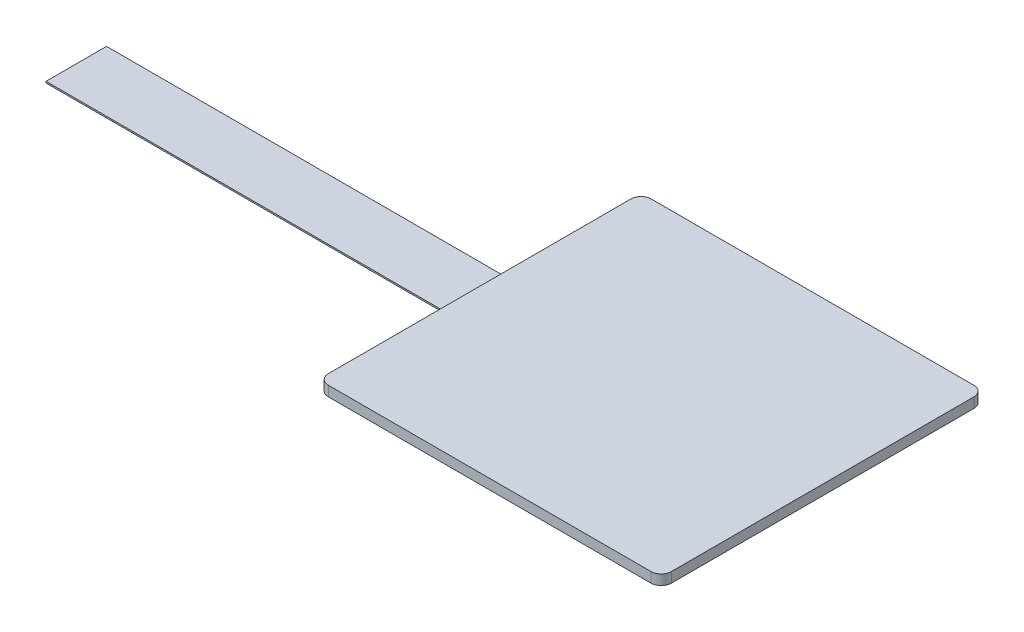
ISO-10303-21;
HEADER;
FILE_DESCRIPTION(('STEP AP214'),'2;1');
FILE_NAME('part.step','',(''),(''),'','','');
FILE_SCHEMA(('AUTOMOTIVE_DESIGN { 1 0 10303 214 1 1 1 1 }'));
ENDSEC;
DATA;
#1=APPLICATION_CONTEXT('core data for automotive mechanical design processes');
#2=APPLICATION_PROTOCOL_DEFINITION('international standard','automotive_design',2000,#1);
#3=PRODUCT_CONTEXT('',#1,'mechanical');
#4=PRODUCT('Part','Part','',(#3));
#5=PRODUCT_RELATED_PRODUCT_CATEGORY('part','',(#4));
#6=PRODUCT_DEFINITION_FORMATION('','',#4);
#7=PRODUCT_DEFINITION_CONTEXT('part definition',#1,'design');
#8=PRODUCT_DEFINITION('design','',#6,#7);
#9=PRODUCT_DEFINITION_SHAPE('','',#8);
#10=(LENGTH_UNIT() NAMED_UNIT(*) SI_UNIT(.MILLI.,.METRE.));
#11=(NAMED_UNIT(*) PLANE_ANGLE_UNIT() SI_UNIT($,.RADIAN.));
#12=(NAMED_UNIT(*) SI_UNIT($,.STERADIAN.) SOLID_ANGLE_UNIT());
#13=UNCERTAINTY_MEASURE_WITH_UNIT(LENGTH_MEASURE(1.E-05),#10,'distance_accuracy_value','');
#14=(GEOMETRIC_REPRESENTATION_CONTEXT(3) GLOBAL_UNCERTAINTY_ASSIGNED_CONTEXT((#13)) GLOBAL_UNIT_ASSIGNED_CONTEXT((#10,
#11,#12)) REPRESENTATION_CONTEXT('',''));
#15=CARTESIAN_POINT('',(0.,0.,0.));
#16=DIRECTION('',(0.,0.,1.));
#17=DIRECTION('',(1.,0.,0.));
#18=AXIS2_PLACEMENT_3D('',#15,#16,#17);
#19=CARTESIAN_POINT('',(-17.,1.,0.));
#20=DIRECTION('',(-1.,0.,0.));
#21=DIRECTION('',(0.,0.,1.));
#22=AXIS2_PLACEMENT_3D('',#19,#20,#21);
#23=PLANE('',#22);
#24=DIRECTION('',(0.,0.,-1.));
#25=VECTOR('',#24,1.);
#26=CARTESIAN_POINT('',(-17.,0.,0.));
#27=LINE('',#26,#25);
#28=CARTESIAN_POINT('',(-17.,0.,15.));
#29=VERTEX_POINT('',#28);
#30=CARTESIAN_POINT('',(-17.,0.,3.));
#31=VERTEX_POINT('',#30);
#32=EDGE_CURVE('E190',#29,#31,#27,.T.);
#33=ORIENTED_EDGE('',*,*,#32,.F.);
#34=DIRECTION('',(0.,-1.,0.));
#35=VECTOR('',#34,1.);
#36=CARTESIAN_POINT('',(-17.,1.,15.));
#37=LINE('',#36,#35);
#38=CARTESIAN_POINT('',(-17.,1.,15.));
#39=VERTEX_POINT('',#38);
#40=EDGE_CURVE('E216',#29,#39,#37,.F.);
#41=ORIENTED_EDGE('',*,*,#40,.T.);
#42=DIRECTION('',(0.,0.,-1.));
#43=VECTOR('',#42,1.);
#44=CARTESIAN_POINT('',(-17.,1.,0.));
#45=LINE('',#44,#43);
#46=CARTESIAN_POINT('',(-17.,1.,-15.));
#47=VERTEX_POINT('',#46);
#48=EDGE_CURVE('E179',#39,#47,#45,.T.);
#49=ORIENTED_EDGE('',*,*,#48,.T.);
#50=DIRECTION('',(0.,-1.,0.));
#51=VECTOR('',#50,1.);
#52=CARTESIAN_POINT('',(-17.,0.,-15.));
#53=LINE('',#52,#51);
#54=CARTESIAN_POINT('',(-17.,0.,-15.));
#55=VERTEX_POINT('',#54);
#56=EDGE_CURVE('E213',#47,#55,#53,.T.);
#57=ORIENTED_EDGE('',*,*,#56,.T.);
#58=CARTESIAN_POINT('',(-17.,0.,-3.));
#59=VERTEX_POINT('',#58);
#60=EDGE_CURVE('E173',#59,#55,#27,.T.);
#61=ORIENTED_EDGE('',*,*,#60,.F.);
#62=DIRECTION('',(0.,1.,0.));
#63=VECTOR('',#62,1.);
#64=CARTESIAN_POINT('',(-17.,-0.05,-3.));
#65=LINE('',#64,#63);
#66=CARTESIAN_POINT('',(-17.,0.1,-3.));
#67=VERTEX_POINT('',#66);
#68=EDGE_CURVE('E177',#59,#67,#65,.T.);
#69=ORIENTED_EDGE('',*,*,#68,.T.);
#70=DIRECTION('',(0.,0.,-1.));
#71=VECTOR('',#70,1.);
#72=CARTESIAN_POINT('',(-17.,0.1,-3.));
#73=LINE('',#72,#71);
#74=CARTESIAN_POINT('',(-17.,0.1,3.));
#75=VERTEX_POINT('',#74);
#76=EDGE_CURVE('E153',#75,#67,#73,.T.);
#77=ORIENTED_EDGE('',*,*,#76,.F.);
#78=DIRECTION('',(0.,1.,0.));
#79=VECTOR('',#78,1.);
#80=CARTESIAN_POINT('',(-17.,-0.05,3.));
#81=LINE('',#80,#79);
#82=EDGE_CURVE('E150',#31,#75,#81,.T.);
#83=ORIENTED_EDGE('',*,*,#82,.F.);
#84=EDGE_LOOP('',(#33,#41,#49,#57,#61,#69,#77,#83));
#85=FACE_BOUND('',#84,.T.);
#86=ADVANCED_FACE('F35',(#85),#23,.T.);
#87=CARTESIAN_POINT('',(0.,1.,16.));
#88=DIRECTION('',(0.,0.,1.));
#89=DIRECTION('',(1.,0.,0.));
#90=AXIS2_PLACEMENT_3D('',#87,#88,#89);
#91=PLANE('',#90);
#92=DIRECTION('',(-1.,0.,0.));
#93=VECTOR('',#92,1.);
#94=CARTESIAN_POINT('',(0.,1.,16.));
#95=LINE('',#94,#93);
#96=CARTESIAN_POINT('',(16.,1.,16.));
#97=VERTEX_POINT('',#96);
#98=CARTESIAN_POINT('',(-16.,1.,16.));
#99=VERTEX_POINT('',#98);
#100=EDGE_CURVE('E182',#97,#99,#95,.T.);
#101=ORIENTED_EDGE('',*,*,#100,.T.);
#102=DIRECTION('',(0.,-1.,0.));
#103=VECTOR('',#102,1.);
#104=CARTESIAN_POINT('',(-16.,1.,16.));
#105=LINE('',#104,#103);
#106=CARTESIAN_POINT('',(-16.,0.,16.));
#107=VERTEX_POINT('',#106);
#108=EDGE_CURVE('E202',#99,#107,#105,.T.);
#109=ORIENTED_EDGE('',*,*,#108,.T.);
#110=DIRECTION('',(-1.,0.,0.));
#111=VECTOR('',#110,1.);
#112=CARTESIAN_POINT('',(0.,0.,16.));
#113=LINE('',#112,#111);
#114=CARTESIAN_POINT('',(16.,0.,16.));
#115=VERTEX_POINT('',#114);
#116=EDGE_CURVE('E192',#115,#107,#113,.T.);
#117=ORIENTED_EDGE('',*,*,#116,.F.);
#118=DIRECTION('',(0.,-1.,0.));
#119=VECTOR('',#118,1.);
#120=CARTESIAN_POINT('',(16.,1.,16.));
#121=LINE('',#120,#119);
#122=EDGE_CURVE('E200',#115,#97,#121,.F.);
#123=ORIENTED_EDGE('',*,*,#122,.T.);
#124=EDGE_LOOP('',(#101,#109,#117,#123));
#125=FACE_BOUND('',#124,.T.);
#126=ADVANCED_FACE('F275',(#125),#91,.T.);
#127=CARTESIAN_POINT('',(17.,1.,0.));
#128=DIRECTION('',(-1.,0.,0.));
#129=DIRECTION('',(0.,0.,1.));
#130=AXIS2_PLACEMENT_3D('',#127,#128,#129);
#131=PLANE('',#130);
#132=DIRECTION('',(0.,0.,-1.));
#133=VECTOR('',#132,1.);
#134=CARTESIAN_POINT('',(17.,1.,0.));
#135=LINE('',#134,#133);
#136=CARTESIAN_POINT('',(17.,1.,15.));
#137=VERTEX_POINT('',#136);
#138=CARTESIAN_POINT('',(17.,1.,-15.));
#139=VERTEX_POINT('',#138);
#140=EDGE_CURVE('E186',#137,#139,#135,.T.);
#141=ORIENTED_EDGE('',*,*,#140,.F.);
#142=DIRECTION('',(0.,-1.,0.));
#143=VECTOR('',#142,1.);
#144=CARTESIAN_POINT('',(17.,0.,15.));
#145=LINE('',#144,#143);
#146=CARTESIAN_POINT('',(17.,0.,15.));
#147=VERTEX_POINT('',#146);
#148=EDGE_CURVE('E227',#137,#147,#145,.T.);
#149=ORIENTED_EDGE('',*,*,#148,.T.);
#150=DIRECTION('',(0.,0.,-1.));
#151=VECTOR('',#150,1.);
#152=CARTESIAN_POINT('',(17.,0.,0.));
#153=LINE('',#152,#151);
#154=CARTESIAN_POINT('',(17.,0.,-15.));
#155=VERTEX_POINT('',#154);
#156=EDGE_CURVE('E196',#147,#155,#153,.T.);
#157=ORIENTED_EDGE('',*,*,#156,.T.);
#158=DIRECTION('',(0.,-1.,0.));
#159=VECTOR('',#158,1.);
#160=CARTESIAN_POINT('',(17.,1.,-15.));
#161=LINE('',#160,#159);
#162=EDGE_CURVE('E225',#155,#139,#161,.F.);
#163=ORIENTED_EDGE('',*,*,#162,.T.);
#164=EDGE_LOOP('',(#141,#149,#157,#163));
#165=FACE_BOUND('',#164,.T.);
#166=ADVANCED_FACE('F233',(#165),#131,.F.);
#167=CARTESIAN_POINT('',(0.,1.,-16.));
#168=DIRECTION('',(0.,0.,1.));
#169=DIRECTION('',(1.,0.,0.));
#170=AXIS2_PLACEMENT_3D('',#167,#168,#169);
#171=PLANE('',#170);
#172=DIRECTION('',(-1.,0.,0.));
#173=VECTOR('',#172,1.);
#174=CARTESIAN_POINT('',(0.,1.,-16.));
#175=LINE('',#174,#173);
#176=CARTESIAN_POINT('',(16.,1.,-16.));
#177=VERTEX_POINT('',#176);
#178=CARTESIAN_POINT('',(-16.,1.,-16.));
#179=VERTEX_POINT('',#178);
#180=EDGE_CURVE('E188',#177,#179,#175,.T.);
#181=ORIENTED_EDGE('',*,*,#180,.F.);
#182=DIRECTION('',(0.,-1.,0.));
#183=VECTOR('',#182,1.);
#184=CARTESIAN_POINT('',(16.,1.,-16.));
#185=LINE('',#184,#183);
#186=CARTESIAN_POINT('',(16.,0.,-16.));
#187=VERTEX_POINT('',#186);
#188=EDGE_CURVE('E11',#177,#187,#185,.T.);
#189=ORIENTED_EDGE('',*,*,#188,.T.);
#190=DIRECTION('',(-1.,0.,0.));
#191=VECTOR('',#190,1.);
#192=CARTESIAN_POINT('',(0.,0.,-16.));
#193=LINE('',#192,#191);
#194=CARTESIAN_POINT('',(-16.,0.,-16.));
#195=VERTEX_POINT('',#194);
#196=EDGE_CURVE('E183',#187,#195,#193,.T.);
#197=ORIENTED_EDGE('',*,*,#196,.T.);
#198=DIRECTION('',(0.,-1.,0.));
#199=VECTOR('',#198,1.);
#200=CARTESIAN_POINT('',(-16.,1.,-16.));
#201=LINE('',#200,#199);
#202=EDGE_CURVE('E43',#195,#179,#201,.F.);
#203=ORIENTED_EDGE('',*,*,#202,.T.);
#204=EDGE_LOOP('',(#181,#189,#197,#203));
#205=FACE_BOUND('',#204,.T.);
#206=ADVANCED_FACE('F244',(#205),#171,.F.);
#207=CARTESIAN_POINT('',(0.,1.,0.));
#208=DIRECTION('',(0.,1.,0.));
#209=DIRECTION('',(0.,0.,1.));
#210=AXIS2_PLACEMENT_3D('',#207,#208,#209);
#211=PLANE('',#210);
#212=ORIENTED_EDGE('',*,*,#48,.F.);
#213=CARTESIAN_POINT('',(-16.,1.,15.));
#214=DIRECTION('',(0.,1.,0.));
#215=DIRECTION('',(0.,0.,1.));
#216=AXIS2_PLACEMENT_3D('',#213,#214,#215);
#217=CIRCLE('',#216,1.);
#218=EDGE_CURVE('E223',#39,#99,#217,.T.);
#219=ORIENTED_EDGE('',*,*,#218,.T.);
#220=ORIENTED_EDGE('',*,*,#100,.F.);
#221=CARTESIAN_POINT('',(16.,1.,15.));
#222=DIRECTION('',(0.,1.,0.));
#223=DIRECTION('',(0.,0.,1.));
#224=AXIS2_PLACEMENT_3D('',#221,#222,#223);
#225=CIRCLE('',#224,1.);
#226=EDGE_CURVE('E221',#97,#137,#225,.T.);
#227=ORIENTED_EDGE('',*,*,#226,.T.);
#228=ORIENTED_EDGE('',*,*,#140,.T.);
#229=CARTESIAN_POINT('',(16.,1.,-15.));
#230=DIRECTION('',(0.,1.,0.));
#231=DIRECTION('',(0.,0.,1.));
#232=AXIS2_PLACEMENT_3D('',#229,#230,#231);
#233=CIRCLE('',#232,1.);
#234=EDGE_CURVE('E56',#139,#177,#233,.T.);
#235=ORIENTED_EDGE('',*,*,#234,.T.);
#236=ORIENTED_EDGE('',*,*,#180,.T.);
#237=CARTESIAN_POINT('',(-16.,1.,-15.));
#238=DIRECTION('',(0.,1.,0.));
#239=DIRECTION('',(0.,0.,1.));
#240=AXIS2_PLACEMENT_3D('',#237,#238,#239);
#241=CIRCLE('',#240,1.);
#242=EDGE_CURVE('E218',#179,#47,#241,.T.);
#243=ORIENTED_EDGE('',*,*,#242,.T.);
#244=EDGE_LOOP('',(#212,#219,#220,#227,#228,#235,#236,#243));
#245=FACE_BOUND('',#244,.T.);
#246=ADVANCED_FACE('F247',(#245),#211,.T.);
#247=CARTESIAN_POINT('',(0.,0.,0.));
#248=DIRECTION('',(0.,1.,0.));
#249=DIRECTION('',(0.,0.,1.));
#250=AXIS2_PLACEMENT_3D('',#247,#248,#249);
#251=PLANE('',#250);
#252=ORIENTED_EDGE('',*,*,#116,.T.);
#253=CARTESIAN_POINT('',(-16.,0.,15.));
#254=DIRECTION('',(0.,1.,0.));
#255=DIRECTION('',(0.,0.,1.));
#256=AXIS2_PLACEMENT_3D('',#253,#254,#255);
#257=CIRCLE('',#256,1.);
#258=EDGE_CURVE('E211',#107,#29,#257,.F.);
#259=ORIENTED_EDGE('',*,*,#258,.T.);
#260=ORIENTED_EDGE('',*,*,#32,.T.);
#261=EDGE_CURVE('E193',#31,#59,#27,.T.);
#262=ORIENTED_EDGE('',*,*,#261,.T.);
#263=ORIENTED_EDGE('',*,*,#60,.T.);
#264=CARTESIAN_POINT('',(-16.,0.,-15.));
#265=DIRECTION('',(0.,1.,0.));
#266=DIRECTION('',(0.,0.,1.));
#267=AXIS2_PLACEMENT_3D('',#264,#265,#266);
#268=CIRCLE('',#267,1.);
#269=EDGE_CURVE('E205',#55,#195,#268,.F.);
#270=ORIENTED_EDGE('',*,*,#269,.T.);
#271=ORIENTED_EDGE('',*,*,#196,.F.);
#272=CARTESIAN_POINT('',(16.,0.,-15.));
#273=DIRECTION('',(0.,1.,0.));
#274=DIRECTION('',(0.,0.,1.));
#275=AXIS2_PLACEMENT_3D('',#272,#273,#274);
#276=CIRCLE('',#275,1.);
#277=EDGE_CURVE('E207',#187,#155,#276,.F.);
#278=ORIENTED_EDGE('',*,*,#277,.T.);
#279=ORIENTED_EDGE('',*,*,#156,.F.);
#280=CARTESIAN_POINT('',(16.,0.,15.));
#281=DIRECTION('',(0.,1.,0.));
#282=DIRECTION('',(0.,0.,1.));
#283=AXIS2_PLACEMENT_3D('',#280,#281,#282);
#284=CIRCLE('',#283,1.);
#285=EDGE_CURVE('E209',#147,#115,#284,.F.);
#286=ORIENTED_EDGE('',*,*,#285,.T.);
#287=EDGE_LOOP('',(#252,#259,#260,#262,#263,#270,#271,#278,#279,#286));
#288=FACE_BOUND('',#287,.T.);
#289=ADVANCED_FACE('F238',(#288),#251,.F.);
#290=CARTESIAN_POINT('',(-17.,-0.05,-3.));
#291=DIRECTION('',(1.,0.,0.));
#292=DIRECTION('',(0.,0.,-1.));
#293=AXIS2_PLACEMENT_3D('',#290,#291,#292);
#294=PLANE('',#293);
#295=ORIENTED_EDGE('',*,*,#261,.F.);
#296=CARTESIAN_POINT('',(-17.,-0.05,3.));
#297=VERTEX_POINT('',#296);
#298=EDGE_CURVE('E141',#297,#31,#81,.T.);
#299=ORIENTED_EDGE('',*,*,#298,.F.);
#300=DIRECTION('',(0.,0.,-1.));
#301=VECTOR('',#300,1.);
#302=CARTESIAN_POINT('',(-17.,-0.05,-3.));
#303=LINE('',#302,#301);
#304=CARTESIAN_POINT('',(-17.,-0.05,-3.));
#305=VERTEX_POINT('',#304);
#306=EDGE_CURVE('E166',#297,#305,#303,.T.);
#307=ORIENTED_EDGE('',*,*,#306,.T.);
#308=EDGE_CURVE('E174',#305,#59,#65,.T.);
#309=ORIENTED_EDGE('',*,*,#308,.T.);
#310=EDGE_LOOP('',(#295,#299,#307,#309));
#311=FACE_BOUND('',#310,.T.);
#312=ADVANCED_FACE('F259',(#311),#294,.T.);
#313=CARTESIAN_POINT('',(-57.,-0.05,-3.));
#314=DIRECTION('',(-1.,0.,0.));
#315=DIRECTION('',(0.,0.,1.));
#316=AXIS2_PLACEMENT_3D('',#313,#314,#315);
#317=PLANE('',#316);
#318=DIRECTION('',(0.,1.,0.));
#319=VECTOR('',#318,1.);
#320=CARTESIAN_POINT('',(-57.,-0.05,3.));
#321=LINE('',#320,#319);
#322=CARTESIAN_POINT('',(-57.,-0.05,3.));
#323=VERTEX_POINT('',#322);
#324=CARTESIAN_POINT('',(-57.,0.1,3.));
#325=VERTEX_POINT('',#324);
#326=EDGE_CURVE('E131',#323,#325,#321,.T.);
#327=ORIENTED_EDGE('',*,*,#326,.T.);
#328=DIRECTION('',(0.,0.,1.));
#329=VECTOR('',#328,1.);
#330=CARTESIAN_POINT('',(-57.,0.1,-3.));
#331=LINE('',#330,#329);
#332=CARTESIAN_POINT('',(-57.,0.1,-3.));
#333=VERTEX_POINT('',#332);
#334=EDGE_CURVE('E135',#333,#325,#331,.T.);
#335=ORIENTED_EDGE('',*,*,#334,.F.);
#336=DIRECTION('',(0.,1.,0.));
#337=VECTOR('',#336,1.);
#338=CARTESIAN_POINT('',(-57.,-0.05,-3.));
#339=LINE('',#338,#337);
#340=CARTESIAN_POINT('',(-57.,-0.05,-3.));
#341=VERTEX_POINT('',#340);
#342=EDGE_CURVE('E171',#341,#333,#339,.T.);
#343=ORIENTED_EDGE('',*,*,#342,.F.);
#344=DIRECTION('',(0.,0.,1.));
#345=VECTOR('',#344,1.);
#346=CARTESIAN_POINT('',(-57.,-0.05,-3.));
#347=LINE('',#346,#345);
#348=EDGE_CURVE('E137',#341,#323,#347,.T.);
#349=ORIENTED_EDGE('',*,*,#348,.T.);
#350=EDGE_LOOP('',(#327,#335,#343,#349));
#351=FACE_BOUND('',#350,.T.);
#352=ADVANCED_FACE('F133',(#351),#317,.T.);
#353=CARTESIAN_POINT('',(-57.,-0.05,-3.));
#354=DIRECTION('',(0.,0.,-1.));
#355=DIRECTION('',(-1.,0.,0.));
#356=AXIS2_PLACEMENT_3D('',#353,#354,#355);
#357=PLANE('',#356);
#358=ORIENTED_EDGE('',*,*,#342,.T.);
#359=DIRECTION('',(-1.,0.,0.));
#360=VECTOR('',#359,1.);
#361=CARTESIAN_POINT('',(-57.,0.1,-3.));
#362=LINE('',#361,#360);
#363=EDGE_CURVE('E158',#67,#333,#362,.T.);
#364=ORIENTED_EDGE('',*,*,#363,.F.);
#365=ORIENTED_EDGE('',*,*,#68,.F.);
#366=ORIENTED_EDGE('',*,*,#308,.F.);
#367=DIRECTION('',(-1.,0.,0.));
#368=VECTOR('',#367,1.);
#369=CARTESIAN_POINT('',(-57.,-0.05,-3.));
#370=LINE('',#369,#368);
#371=EDGE_CURVE('E142',#305,#341,#370,.T.);
#372=ORIENTED_EDGE('',*,*,#371,.T.);
#373=EDGE_LOOP('',(#358,#364,#365,#366,#372));
#374=FACE_BOUND('',#373,.T.);
#375=ADVANCED_FACE('F258',(#374),#357,.T.);
#376=CARTESIAN_POINT('',(-57.,-0.05,3.));
#377=DIRECTION('',(0.,0.,1.));
#378=DIRECTION('',(1.,0.,0.));
#379=AXIS2_PLACEMENT_3D('',#376,#377,#378);
#380=PLANE('',#379);
#381=ORIENTED_EDGE('',*,*,#298,.T.);
#382=ORIENTED_EDGE('',*,*,#82,.T.);
#383=DIRECTION('',(1.,0.,0.));
#384=VECTOR('',#383,1.);
#385=CARTESIAN_POINT('',(-57.,0.1,3.));
#386=LINE('',#385,#384);
#387=EDGE_CURVE('E146',#325,#75,#386,.T.);
#388=ORIENTED_EDGE('',*,*,#387,.F.);
#389=ORIENTED_EDGE('',*,*,#326,.F.);
#390=DIRECTION('',(1.,0.,0.));
#391=VECTOR('',#390,1.);
#392=CARTESIAN_POINT('',(-57.,-0.05,3.));
#393=LINE('',#392,#391);
#394=EDGE_CURVE('E164',#323,#297,#393,.T.);
#395=ORIENTED_EDGE('',*,*,#394,.T.);
#396=EDGE_LOOP('',(#381,#382,#388,#389,#395));
#397=FACE_BOUND('',#396,.T.);
#398=ADVANCED_FACE('F148',(#397),#380,.T.);
#399=CARTESIAN_POINT('',(0.,-0.05,0.));
#400=DIRECTION('',(0.,1.,0.));
#401=DIRECTION('',(0.,0.,1.));
#402=AXIS2_PLACEMENT_3D('',#399,#400,#401);
#403=PLANE('',#402);
#404=ORIENTED_EDGE('',*,*,#348,.F.);
#405=ORIENTED_EDGE('',*,*,#371,.F.);
#406=ORIENTED_EDGE('',*,*,#306,.F.);
#407=ORIENTED_EDGE('',*,*,#394,.F.);
#408=EDGE_LOOP('',(#404,#405,#406,#407));
#409=FACE_BOUND('',#408,.T.);
#410=ADVANCED_FACE('F263',(#409),#403,.F.);
#411=CARTESIAN_POINT('',(0.,0.1,0.));
#412=DIRECTION('',(0.,1.,0.));
#413=DIRECTION('',(0.,0.,1.));
#414=AXIS2_PLACEMENT_3D('',#411,#412,#413);
#415=PLANE('',#414);
#416=ORIENTED_EDGE('',*,*,#334,.T.);
#417=ORIENTED_EDGE('',*,*,#387,.T.);
#418=ORIENTED_EDGE('',*,*,#76,.T.);
#419=ORIENTED_EDGE('',*,*,#363,.T.);
#420=EDGE_LOOP('',(#416,#417,#418,#419));
#421=FACE_BOUND('',#420,.T.);
#422=ADVANCED_FACE('F156',(#421),#415,.T.);
#423=CARTESIAN_POINT('',(-16.,1.,15.));
#424=DIRECTION('',(0.,-1.,0.));
#425=DIRECTION('',(0.,0.,-1.));
#426=AXIS2_PLACEMENT_3D('',#423,#424,#425);
#427=CYLINDRICAL_SURFACE('',#426,1.);
#428=ORIENTED_EDGE('',*,*,#218,.F.);
#429=ORIENTED_EDGE('',*,*,#40,.F.);
#430=ORIENTED_EDGE('',*,*,#258,.F.);
#431=ORIENTED_EDGE('',*,*,#108,.F.);
#432=EDGE_LOOP('',(#428,#429,#430,#431));
#433=FACE_BOUND('',#432,.T.);
#434=ADVANCED_FACE('F270',(#433),#427,.T.);
#435=CARTESIAN_POINT('',(16.,1.,15.));
#436=DIRECTION('',(0.,1.,0.));
#437=DIRECTION('',(0.,0.,1.));
#438=AXIS2_PLACEMENT_3D('',#435,#436,#437);
#439=CYLINDRICAL_SURFACE('',#438,1.);
#440=ORIENTED_EDGE('',*,*,#226,.F.);
#441=ORIENTED_EDGE('',*,*,#122,.F.);
#442=ORIENTED_EDGE('',*,*,#285,.F.);
#443=ORIENTED_EDGE('',*,*,#148,.F.);
#444=EDGE_LOOP('',(#440,#441,#442,#443));
#445=FACE_BOUND('',#444,.T.);
#446=ADVANCED_FACE('F286',(#445),#439,.T.);
#447=CARTESIAN_POINT('',(16.,1.,-15.));
#448=DIRECTION('',(0.,-1.,0.));
#449=DIRECTION('',(0.,0.,-1.));
#450=AXIS2_PLACEMENT_3D('',#447,#448,#449);
#451=CYLINDRICAL_SURFACE('',#450,1.);
#452=ORIENTED_EDGE('',*,*,#234,.F.);
#453=ORIENTED_EDGE('',*,*,#162,.F.);
#454=ORIENTED_EDGE('',*,*,#277,.F.);
#455=ORIENTED_EDGE('',*,*,#188,.F.);
#456=EDGE_LOOP('',(#452,#453,#454,#455));
#457=FACE_BOUND('',#456,.T.);
#458=ADVANCED_FACE('F243',(#457),#451,.T.);
#459=CARTESIAN_POINT('',(-16.,1.,-15.));
#460=DIRECTION('',(0.,1.,0.));
#461=DIRECTION('',(0.,0.,1.));
#462=AXIS2_PLACEMENT_3D('',#459,#460,#461);
#463=CYLINDRICAL_SURFACE('',#462,1.);
#464=ORIENTED_EDGE('',*,*,#242,.F.);
#465=ORIENTED_EDGE('',*,*,#202,.F.);
#466=ORIENTED_EDGE('',*,*,#269,.F.);
#467=ORIENTED_EDGE('',*,*,#56,.F.);
#468=EDGE_LOOP('',(#464,#465,#466,#467));
#469=FACE_BOUND('',#468,.T.);
#470=ADVANCED_FACE('F37',(#469),#463,.T.);
#471=CLOSED_SHELL('',(#86,#126,#166,#206,#246,#289,#312,#352,#375,#398,#410,#422,#434,#446,#458,#470));
#472=MANIFOLD_SOLID_BREP('B2',#471);
#473=ADVANCED_BREP_SHAPE_REPRESENTATION('',(#18,#472),#14);
#474=SHAPE_DEFINITION_REPRESENTATION(#9,#473);
ENDSEC;
END-ISO-10303-21;
